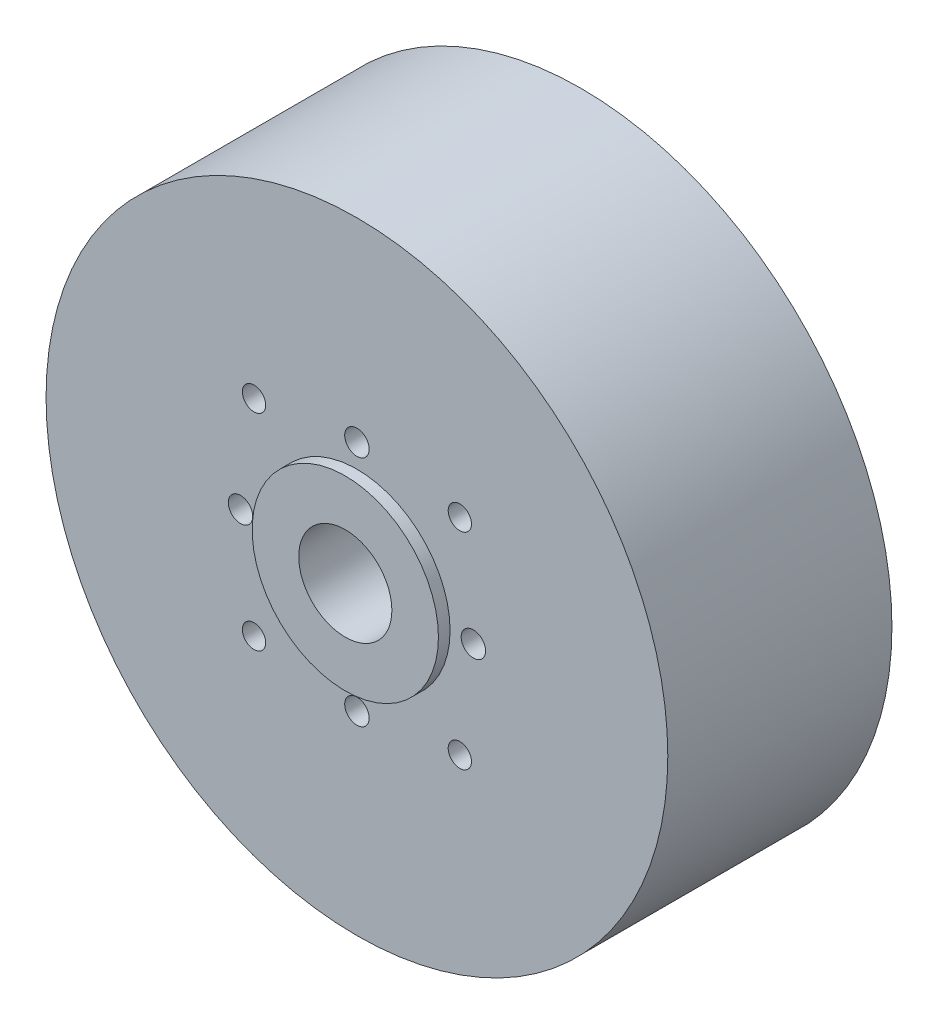
ISO-10303-21;
HEADER;
FILE_DESCRIPTION(('STEP AP214'),'2;1');
FILE_NAME('part.step','',(''),(''),'','','');
FILE_SCHEMA(('AUTOMOTIVE_DESIGN { 1 0 10303 214 1 1 1 1 }'));
ENDSEC;
DATA;
#1=APPLICATION_CONTEXT('core data for automotive mechanical design processes');
#2=APPLICATION_PROTOCOL_DEFINITION('international standard','automotive_design',2000,#1);
#3=PRODUCT_CONTEXT('',#1,'mechanical');
#4=PRODUCT('Part','Part','',(#3));
#5=PRODUCT_RELATED_PRODUCT_CATEGORY('part','',(#4));
#6=PRODUCT_DEFINITION_FORMATION('','',#4);
#7=PRODUCT_DEFINITION_CONTEXT('part definition',#1,'design');
#8=PRODUCT_DEFINITION('design','',#6,#7);
#9=PRODUCT_DEFINITION_SHAPE('','',#8);
#10=(LENGTH_UNIT() NAMED_UNIT(*) SI_UNIT(.MILLI.,.METRE.));
#11=(NAMED_UNIT(*) PLANE_ANGLE_UNIT() SI_UNIT($,.RADIAN.));
#12=(NAMED_UNIT(*) SI_UNIT($,.STERADIAN.) SOLID_ANGLE_UNIT());
#13=UNCERTAINTY_MEASURE_WITH_UNIT(LENGTH_MEASURE(1.E-05),#10,'distance_accuracy_value','');
#14=(GEOMETRIC_REPRESENTATION_CONTEXT(3) GLOBAL_UNCERTAINTY_ASSIGNED_CONTEXT((#13)) GLOBAL_UNIT_ASSIGNED_CONTEXT((#10,
#11,#12)) REPRESENTATION_CONTEXT('',''));
#15=CARTESIAN_POINT('',(0.,0.,0.));
#16=DIRECTION('',(0.,0.,1.));
#17=DIRECTION('',(1.,0.,0.));
#18=AXIS2_PLACEMENT_3D('',#15,#16,#17);
#19=CARTESIAN_POINT('',(0.,0.,0.));
#20=DIRECTION('',(0.,0.,1.));
#21=DIRECTION('',(1.,0.,0.));
#22=AXIS2_PLACEMENT_3D('',#19,#20,#21);
#23=PLANE('',#22);
#24=CARTESIAN_POINT('',(0.,-20.,0.));
#25=DIRECTION('',(0.,0.,1.));
#26=DIRECTION('',(1.,0.,0.));
#27=AXIS2_PLACEMENT_3D('',#24,#25,#26);
#28=CIRCLE('',#27,2.1);
#29=CARTESIAN_POINT('',(2.1,-20.,0.));
#30=VERTEX_POINT('',#29);
#31=EDGE_CURVE('E99',#30,#30,#28,.T.);
#32=ORIENTED_EDGE('',*,*,#31,.F.);
#33=EDGE_LOOP('',(#32));
#34=FACE_BOUND('',#33,.T.);
#35=CARTESIAN_POINT('',(20.,0.,0.));
#36=DIRECTION('',(0.,0.,1.));
#37=DIRECTION('',(1.,0.,0.));
#38=AXIS2_PLACEMENT_3D('',#35,#36,#37);
#39=CIRCLE('',#38,2.1);
#40=CARTESIAN_POINT('',(22.1,0.,0.));
#41=VERTEX_POINT('',#40);
#42=EDGE_CURVE('E96',#41,#41,#39,.T.);
#43=ORIENTED_EDGE('',*,*,#42,.F.);
#44=EDGE_LOOP('',(#43));
#45=FACE_BOUND('',#44,.T.);
#46=CARTESIAN_POINT('',(0.,20.,0.));
#47=DIRECTION('',(0.,0.,1.));
#48=DIRECTION('',(1.,0.,0.));
#49=AXIS2_PLACEMENT_3D('',#46,#47,#48);
#50=CIRCLE('',#49,2.1);
#51=CARTESIAN_POINT('',(2.1,20.,0.));
#52=VERTEX_POINT('',#51);
#53=EDGE_CURVE('E90',#52,#52,#50,.T.);
#54=ORIENTED_EDGE('',*,*,#53,.F.);
#55=EDGE_LOOP('',(#54));
#56=FACE_BOUND('',#55,.T.);
#57=CARTESIAN_POINT('',(-20.,0.,0.));
#58=DIRECTION('',(0.,0.,1.));
#59=DIRECTION('',(1.,0.,0.));
#60=AXIS2_PLACEMENT_3D('',#57,#58,#59);
#61=CIRCLE('',#60,2.1);
#62=CARTESIAN_POINT('',(-17.9,0.,0.));
#63=VERTEX_POINT('',#62);
#64=EDGE_CURVE('E83',#63,#63,#61,.T.);
#65=ORIENTED_EDGE('',*,*,#64,.F.);
#66=EDGE_LOOP('',(#65));
#67=FACE_BOUND('',#66,.T.);
#68=CARTESIAN_POINT('',(0.,0.,0.));
#69=DIRECTION('',(0.,0.,1.));
#70=DIRECTION('',(1.,0.,0.));
#71=AXIS2_PLACEMENT_3D('',#68,#69,#70);
#72=CIRCLE('',#71,53.4);
#73=CARTESIAN_POINT('',(53.4,0.,0.));
#74=VERTEX_POINT('',#73);
#75=EDGE_CURVE('E35',#74,#74,#72,.T.);
#76=ORIENTED_EDGE('',*,*,#75,.T.);
#77=EDGE_LOOP('',(#76));
#78=FACE_BOUND('',#77,.T.);
#79=CARTESIAN_POINT('',(17.6776695296637,-17.6776695296637,0.));
#80=DIRECTION('',(0.,0.,1.));
#81=DIRECTION('',(1.,0.,0.));
#82=AXIS2_PLACEMENT_3D('',#79,#80,#81);
#83=CIRCLE('',#82,2.);
#84=CARTESIAN_POINT('',(19.6776695296637,-17.6776695296637,0.));
#85=VERTEX_POINT('',#84);
#86=EDGE_CURVE('E47',#85,#85,#83,.T.);
#87=ORIENTED_EDGE('',*,*,#86,.F.);
#88=EDGE_LOOP('',(#87));
#89=FACE_BOUND('',#88,.T.);
#90=CARTESIAN_POINT('',(17.6776695296637,17.6776695296637,0.));
#91=DIRECTION('',(0.,0.,1.));
#92=DIRECTION('',(1.,0.,0.));
#93=AXIS2_PLACEMENT_3D('',#90,#91,#92);
#94=CIRCLE('',#93,2.);
#95=CARTESIAN_POINT('',(19.6776695296637,17.6776695296637,0.));
#96=VERTEX_POINT('',#95);
#97=EDGE_CURVE('E50',#96,#96,#94,.T.);
#98=ORIENTED_EDGE('',*,*,#97,.F.);
#99=EDGE_LOOP('',(#98));
#100=FACE_BOUND('',#99,.T.);
#101=CARTESIAN_POINT('',(-17.6776695296638,17.6776695296636,0.));
#102=DIRECTION('',(0.,0.,1.));
#103=DIRECTION('',(1.,0.,0.));
#104=AXIS2_PLACEMENT_3D('',#101,#102,#103);
#105=CIRCLE('',#104,2.00000000000001);
#106=CARTESIAN_POINT('',(-15.6776695296638,17.6776695296636,0.));
#107=VERTEX_POINT('',#106);
#108=EDGE_CURVE('E63',#107,#107,#105,.T.);
#109=ORIENTED_EDGE('',*,*,#108,.F.);
#110=EDGE_LOOP('',(#109));
#111=FACE_BOUND('',#110,.T.);
#112=CARTESIAN_POINT('',(-17.6776695296636,-17.6776695296638,0.));
#113=DIRECTION('',(0.,0.,1.));
#114=DIRECTION('',(1.,0.,0.));
#115=AXIS2_PLACEMENT_3D('',#112,#113,#114);
#116=CIRCLE('',#115,1.99999999999999);
#117=CARTESIAN_POINT('',(-15.6776695296636,-17.6776695296638,0.));
#118=VERTEX_POINT('',#117);
#119=EDGE_CURVE('E56',#118,#118,#116,.T.);
#120=ORIENTED_EDGE('',*,*,#119,.F.);
#121=EDGE_LOOP('',(#120));
#122=FACE_BOUND('',#121,.T.);
#123=CARTESIAN_POINT('',(0.,0.,0.));
#124=DIRECTION('',(0.,0.,1.));
#125=DIRECTION('',(1.,0.,0.));
#126=AXIS2_PLACEMENT_3D('',#123,#124,#125);
#127=CIRCLE('',#126,16.);
#128=CARTESIAN_POINT('',(16.,0.,0.));
#129=VERTEX_POINT('',#128);
#130=EDGE_CURVE('E71',#129,#129,#127,.T.);
#131=ORIENTED_EDGE('',*,*,#130,.F.);
#132=EDGE_LOOP('',(#131));
#133=FACE_BOUND('',#132,.T.);
#134=ADVANCED_FACE('F31',(#34,#45,#56,#67,#78,#89,#100,#111,#122,#133),#23,.T.);
#135=CARTESIAN_POINT('',(0.,0.,-38.5));
#136=DIRECTION('',(0.,0.,1.));
#137=DIRECTION('',(1.,0.,0.));
#138=AXIS2_PLACEMENT_3D('',#135,#136,#137);
#139=CYLINDRICAL_SURFACE('',#138,53.4);
#140=CARTESIAN_POINT('',(0.,0.,-38.5));
#141=DIRECTION('',(0.,0.,1.));
#142=DIRECTION('',(1.,0.,0.));
#143=AXIS2_PLACEMENT_3D('',#140,#141,#142);
#144=CIRCLE('',#143,53.4);
#145=CARTESIAN_POINT('',(53.4,0.,-38.5));
#146=VERTEX_POINT('',#145);
#147=EDGE_CURVE('E10',#146,#146,#144,.T.);
#148=ORIENTED_EDGE('',*,*,#147,.T.);
#149=EDGE_LOOP('',(#148));
#150=FACE_BOUND('',#149,.T.);
#151=ORIENTED_EDGE('',*,*,#75,.F.);
#152=EDGE_LOOP('',(#151));
#153=FACE_BOUND('',#152,.T.);
#154=ADVANCED_FACE('F33',(#150,#153),#139,.T.);
#155=CARTESIAN_POINT('',(0.,0.,-38.5));
#156=DIRECTION('',(0.,0.,1.));
#157=DIRECTION('',(1.,0.,0.));
#158=AXIS2_PLACEMENT_3D('',#155,#156,#157);
#159=PLANE('',#158);
#160=CARTESIAN_POINT('',(30.,0.,-38.5));
#161=DIRECTION('',(0.,0.,-1.));
#162=DIRECTION('',(-1.,0.,0.));
#163=AXIS2_PLACEMENT_3D('',#160,#161,#162);
#164=CIRCLE('',#163,2.5);
#165=CARTESIAN_POINT('',(27.5,0.,-38.5));
#166=VERTEX_POINT('',#165);
#167=EDGE_CURVE('E122',#166,#166,#164,.T.);
#168=ORIENTED_EDGE('',*,*,#167,.F.);
#169=EDGE_LOOP('',(#168));
#170=FACE_BOUND('',#169,.T.);
#171=CARTESIAN_POINT('',(0.,30.,-38.5));
#172=DIRECTION('',(0.,0.,-1.));
#173=DIRECTION('',(-1.,0.,0.));
#174=AXIS2_PLACEMENT_3D('',#171,#172,#173);
#175=CIRCLE('',#174,2.5);
#176=CARTESIAN_POINT('',(-2.5,30.,-38.5));
#177=VERTEX_POINT('',#176);
#178=EDGE_CURVE('E119',#177,#177,#175,.T.);
#179=ORIENTED_EDGE('',*,*,#178,.F.);
#180=EDGE_LOOP('',(#179));
#181=FACE_BOUND('',#180,.T.);
#182=CARTESIAN_POINT('',(-30.,0.,-38.5));
#183=DIRECTION('',(0.,0.,-1.));
#184=DIRECTION('',(-1.,0.,0.));
#185=AXIS2_PLACEMENT_3D('',#182,#183,#184);
#186=CIRCLE('',#185,2.5);
#187=CARTESIAN_POINT('',(-32.5,0.,-38.5));
#188=VERTEX_POINT('',#187);
#189=EDGE_CURVE('E113',#188,#188,#186,.T.);
#190=ORIENTED_EDGE('',*,*,#189,.F.);
#191=EDGE_LOOP('',(#190));
#192=FACE_BOUND('',#191,.T.);
#193=CARTESIAN_POINT('',(0.,-30.,-38.5));
#194=DIRECTION('',(0.,0.,-1.));
#195=DIRECTION('',(-1.,0.,0.));
#196=AXIS2_PLACEMENT_3D('',#193,#194,#195);
#197=CIRCLE('',#196,2.5);
#198=CARTESIAN_POINT('',(-2.5,-30.,-38.5));
#199=VERTEX_POINT('',#198);
#200=EDGE_CURVE('E107',#199,#199,#197,.T.);
#201=ORIENTED_EDGE('',*,*,#200,.F.);
#202=EDGE_LOOP('',(#201));
#203=FACE_BOUND('',#202,.T.);
#204=CARTESIAN_POINT('',(0.,0.,-38.5));
#205=DIRECTION('',(0.,0.,1.));
#206=DIRECTION('',(1.,0.,0.));
#207=AXIS2_PLACEMENT_3D('',#204,#205,#206);
#208=CIRCLE('',#207,8.);
#209=CARTESIAN_POINT('',(8.,0.,-38.5));
#210=VERTEX_POINT('',#209);
#211=EDGE_CURVE('E42',#210,#210,#208,.T.);
#212=ORIENTED_EDGE('',*,*,#211,.T.);
#213=EDGE_LOOP('',(#212));
#214=FACE_BOUND('',#213,.T.);
#215=ORIENTED_EDGE('',*,*,#147,.F.);
#216=EDGE_LOOP('',(#215));
#217=FACE_BOUND('',#216,.T.);
#218=ADVANCED_FACE('F137',(#170,#181,#192,#203,#214,#217),#159,.F.);
#219=CARTESIAN_POINT('',(0.,0.,-38.5));
#220=DIRECTION('',(0.,0.,1.));
#221=DIRECTION('',(1.,0.,0.));
#222=AXIS2_PLACEMENT_3D('',#219,#220,#221);
#223=CYLINDRICAL_SURFACE('',#222,8.);
#224=ORIENTED_EDGE('',*,*,#211,.F.);
#225=EDGE_LOOP('',(#224));
#226=FACE_BOUND('',#225,.T.);
#227=CARTESIAN_POINT('',(0.,0.,2.));
#228=DIRECTION('',(0.,0.,1.));
#229=DIRECTION('',(1.,0.,0.));
#230=AXIS2_PLACEMENT_3D('',#227,#228,#229);
#231=CIRCLE('',#230,8.);
#232=CARTESIAN_POINT('',(8.,0.,2.));
#233=VERTEX_POINT('',#232);
#234=EDGE_CURVE('E74',#233,#233,#231,.T.);
#235=ORIENTED_EDGE('',*,*,#234,.T.);
#236=EDGE_LOOP('',(#235));
#237=FACE_BOUND('',#236,.T.);
#238=ADVANCED_FACE('F140',(#226,#237),#223,.F.);
#239=CARTESIAN_POINT('',(17.6776695296637,-17.6776695296637,-20.));
#240=DIRECTION('',(0.,0.,1.));
#241=DIRECTION('',(1.,0.,0.));
#242=AXIS2_PLACEMENT_3D('',#239,#240,#241);
#243=CYLINDRICAL_SURFACE('',#242,2.);
#244=CARTESIAN_POINT('',(17.6776695296637,-17.6776695296637,-20.));
#245=DIRECTION('',(0.,0.,1.));
#246=DIRECTION('',(1.,0.,0.));
#247=AXIS2_PLACEMENT_3D('',#244,#245,#246);
#248=CIRCLE('',#247,2.);
#249=CARTESIAN_POINT('',(19.6776695296637,-17.6776695296637,-20.));
#250=VERTEX_POINT('',#249);
#251=EDGE_CURVE('E46',#250,#250,#248,.T.);
#252=ORIENTED_EDGE('',*,*,#251,.F.);
#253=EDGE_LOOP('',(#252));
#254=FACE_BOUND('',#253,.T.);
#255=ORIENTED_EDGE('',*,*,#86,.T.);
#256=EDGE_LOOP('',(#255));
#257=FACE_BOUND('',#256,.T.);
#258=ADVANCED_FACE('F153',(#254,#257),#243,.F.);
#259=CARTESIAN_POINT('',(17.6776695296637,-17.6776695296637,-20.));
#260=DIRECTION('',(0.,0.,1.));
#261=DIRECTION('',(1.,0.,0.));
#262=AXIS2_PLACEMENT_3D('',#259,#260,#261);
#263=PLANE('',#262);
#264=ORIENTED_EDGE('',*,*,#251,.T.);
#265=EDGE_LOOP('',(#264));
#266=FACE_BOUND('',#265,.T.);
#267=ADVANCED_FACE('F186',(#266),#263,.T.);
#268=CARTESIAN_POINT('',(17.6776695296637,17.6776695296637,-20.));
#269=DIRECTION('',(0.,0.,1.));
#270=DIRECTION('',(1.,0.,0.));
#271=AXIS2_PLACEMENT_3D('',#268,#269,#270);
#272=CYLINDRICAL_SURFACE('',#271,2.);
#273=CARTESIAN_POINT('',(17.6776695296637,17.6776695296637,-20.));
#274=DIRECTION('',(0.,0.,1.));
#275=DIRECTION('',(1.,0.,0.));
#276=AXIS2_PLACEMENT_3D('',#273,#274,#275);
#277=CIRCLE('',#276,2.);
#278=CARTESIAN_POINT('',(19.6776695296637,17.6776695296637,-20.));
#279=VERTEX_POINT('',#278);
#280=EDGE_CURVE('E66',#279,#279,#277,.T.);
#281=ORIENTED_EDGE('',*,*,#280,.F.);
#282=EDGE_LOOP('',(#281));
#283=FACE_BOUND('',#282,.T.);
#284=ORIENTED_EDGE('',*,*,#97,.T.);
#285=EDGE_LOOP('',(#284));
#286=FACE_BOUND('',#285,.T.);
#287=ADVANCED_FACE('F189',(#283,#286),#272,.F.);
#288=CARTESIAN_POINT('',(17.6776695296637,17.6776695296637,-20.));
#289=DIRECTION('',(0.,0.,1.));
#290=DIRECTION('',(1.,0.,0.));
#291=AXIS2_PLACEMENT_3D('',#288,#289,#290);
#292=PLANE('',#291);
#293=ORIENTED_EDGE('',*,*,#280,.T.);
#294=EDGE_LOOP('',(#293));
#295=FACE_BOUND('',#294,.T.);
#296=ADVANCED_FACE('F202',(#295),#292,.T.);
#297=CARTESIAN_POINT('',(-17.6776695296638,17.6776695296636,-20.));
#298=DIRECTION('',(0.,0.,1.));
#299=DIRECTION('',(1.,0.,0.));
#300=AXIS2_PLACEMENT_3D('',#297,#298,#299);
#301=CYLINDRICAL_SURFACE('',#300,2.00000000000001);
#302=CARTESIAN_POINT('',(-17.6776695296638,17.6776695296636,-20.));
#303=DIRECTION('',(0.,0.,1.));
#304=DIRECTION('',(1.,0.,0.));
#305=AXIS2_PLACEMENT_3D('',#302,#303,#304);
#306=CIRCLE('',#305,2.00000000000001);
#307=CARTESIAN_POINT('',(-15.6776695296638,17.6776695296636,-20.));
#308=VERTEX_POINT('',#307);
#309=EDGE_CURVE('E60',#308,#308,#306,.T.);
#310=ORIENTED_EDGE('',*,*,#309,.F.);
#311=EDGE_LOOP('',(#310));
#312=FACE_BOUND('',#311,.T.);
#313=ORIENTED_EDGE('',*,*,#108,.T.);
#314=EDGE_LOOP('',(#313));
#315=FACE_BOUND('',#314,.T.);
#316=ADVANCED_FACE('F198',(#312,#315),#301,.F.);
#317=CARTESIAN_POINT('',(-17.6776695296638,17.6776695296636,-20.));
#318=DIRECTION('',(0.,0.,1.));
#319=DIRECTION('',(1.,0.,0.));
#320=AXIS2_PLACEMENT_3D('',#317,#318,#319);
#321=PLANE('',#320);
#322=ORIENTED_EDGE('',*,*,#309,.T.);
#323=EDGE_LOOP('',(#322));
#324=FACE_BOUND('',#323,.T.);
#325=ADVANCED_FACE('F194',(#324),#321,.T.);
#326=CARTESIAN_POINT('',(-17.6776695296636,-17.6776695296638,-20.));
#327=DIRECTION('',(0.,0.,1.));
#328=DIRECTION('',(1.,0.,0.));
#329=AXIS2_PLACEMENT_3D('',#326,#327,#328);
#330=CYLINDRICAL_SURFACE('',#329,1.99999999999999);
#331=CARTESIAN_POINT('',(-17.6776695296636,-17.6776695296638,-20.));
#332=DIRECTION('',(0.,0.,1.));
#333=DIRECTION('',(1.,0.,0.));
#334=AXIS2_PLACEMENT_3D('',#331,#332,#333);
#335=CIRCLE('',#334,1.99999999999999);
#336=CARTESIAN_POINT('',(-15.6776695296636,-17.6776695296638,-20.));
#337=VERTEX_POINT('',#336);
#338=EDGE_CURVE('E53',#337,#337,#335,.T.);
#339=ORIENTED_EDGE('',*,*,#338,.F.);
#340=EDGE_LOOP('',(#339));
#341=FACE_BOUND('',#340,.T.);
#342=ORIENTED_EDGE('',*,*,#119,.T.);
#343=EDGE_LOOP('',(#342));
#344=FACE_BOUND('',#343,.T.);
#345=ADVANCED_FACE('F170',(#341,#344),#330,.F.);
#346=CARTESIAN_POINT('',(-17.6776695296636,-17.6776695296638,-20.));
#347=DIRECTION('',(0.,0.,1.));
#348=DIRECTION('',(1.,0.,0.));
#349=AXIS2_PLACEMENT_3D('',#346,#347,#348);
#350=PLANE('',#349);
#351=ORIENTED_EDGE('',*,*,#338,.T.);
#352=EDGE_LOOP('',(#351));
#353=FACE_BOUND('',#352,.T.);
#354=ADVANCED_FACE('F160',(#353),#350,.T.);
#355=CARTESIAN_POINT('',(0.,0.,2.));
#356=DIRECTION('',(0.,0.,1.));
#357=DIRECTION('',(1.,0.,0.));
#358=AXIS2_PLACEMENT_3D('',#355,#356,#357);
#359=PLANE('',#358);
#360=CARTESIAN_POINT('',(0.,0.,2.));
#361=DIRECTION('',(0.,0.,1.));
#362=DIRECTION('',(1.,0.,0.));
#363=AXIS2_PLACEMENT_3D('',#360,#361,#362);
#364=CIRCLE('',#363,16.);
#365=CARTESIAN_POINT('',(16.,0.,2.));
#366=VERTEX_POINT('',#365);
#367=EDGE_CURVE('E57',#366,#366,#364,.T.);
#368=ORIENTED_EDGE('',*,*,#367,.T.);
#369=EDGE_LOOP('',(#368));
#370=FACE_BOUND('',#369,.T.);
#371=ORIENTED_EDGE('',*,*,#234,.F.);
#372=EDGE_LOOP('',(#371));
#373=FACE_BOUND('',#372,.T.);
#374=ADVANCED_FACE('F157',(#370,#373),#359,.T.);
#375=CARTESIAN_POINT('',(0.,0.,2.));
#376=DIRECTION('',(0.,0.,-1.));
#377=DIRECTION('',(-1.,0.,0.));
#378=AXIS2_PLACEMENT_3D('',#375,#376,#377);
#379=CYLINDRICAL_SURFACE('',#378,16.);
#380=ORIENTED_EDGE('',*,*,#367,.F.);
#381=EDGE_LOOP('',(#380));
#382=FACE_BOUND('',#381,.T.);
#383=ORIENTED_EDGE('',*,*,#130,.T.);
#384=EDGE_LOOP('',(#383));
#385=FACE_BOUND('',#384,.T.);
#386=ADVANCED_FACE('F159',(#382,#385),#379,.T.);
#387=CARTESIAN_POINT('',(-20.,0.,-20.));
#388=DIRECTION('',(0.,0.,1.));
#389=DIRECTION('',(1.,0.,0.));
#390=AXIS2_PLACEMENT_3D('',#387,#388,#389);
#391=CYLINDRICAL_SURFACE('',#390,2.1);
#392=CARTESIAN_POINT('',(-20.,0.,-20.));
#393=DIRECTION('',(0.,0.,1.));
#394=DIRECTION('',(1.,0.,0.));
#395=AXIS2_PLACEMENT_3D('',#392,#393,#394);
#396=CIRCLE('',#395,2.1);
#397=CARTESIAN_POINT('',(-17.9,0.,-20.));
#398=VERTEX_POINT('',#397);
#399=EDGE_CURVE('E80',#398,#398,#396,.T.);
#400=ORIENTED_EDGE('',*,*,#399,.F.);
#401=EDGE_LOOP('',(#400));
#402=FACE_BOUND('',#401,.T.);
#403=ORIENTED_EDGE('',*,*,#64,.T.);
#404=EDGE_LOOP('',(#403));
#405=FACE_BOUND('',#404,.T.);
#406=ADVANCED_FACE('F167',(#402,#405),#391,.F.);
#407=CARTESIAN_POINT('',(-20.,0.,-20.));
#408=DIRECTION('',(0.,0.,1.));
#409=DIRECTION('',(1.,0.,0.));
#410=AXIS2_PLACEMENT_3D('',#407,#408,#409);
#411=PLANE('',#410);
#412=ORIENTED_EDGE('',*,*,#399,.T.);
#413=EDGE_LOOP('',(#412));
#414=FACE_BOUND('',#413,.T.);
#415=ADVANCED_FACE('F272',(#414),#411,.T.);
#416=CARTESIAN_POINT('',(0.,20.,-20.));
#417=DIRECTION('',(0.,0.,1.));
#418=DIRECTION('',(1.,0.,0.));
#419=AXIS2_PLACEMENT_3D('',#416,#417,#418);
#420=CYLINDRICAL_SURFACE('',#419,2.1);
#421=CARTESIAN_POINT('',(0.,20.,-20.));
#422=DIRECTION('',(0.,0.,1.));
#423=DIRECTION('',(1.,0.,0.));
#424=AXIS2_PLACEMENT_3D('',#421,#422,#423);
#425=CIRCLE('',#424,2.1);
#426=CARTESIAN_POINT('',(2.1,20.,-20.));
#427=VERTEX_POINT('',#426);
#428=EDGE_CURVE('E87',#427,#427,#425,.T.);
#429=ORIENTED_EDGE('',*,*,#428,.F.);
#430=EDGE_LOOP('',(#429));
#431=FACE_BOUND('',#430,.T.);
#432=ORIENTED_EDGE('',*,*,#53,.T.);
#433=EDGE_LOOP('',(#432));
#434=FACE_BOUND('',#433,.T.);
#435=ADVANCED_FACE('F279',(#431,#434),#420,.F.);
#436=CARTESIAN_POINT('',(0.,20.,-20.));
#437=DIRECTION('',(0.,0.,1.));
#438=DIRECTION('',(1.,0.,0.));
#439=AXIS2_PLACEMENT_3D('',#436,#437,#438);
#440=PLANE('',#439);
#441=ORIENTED_EDGE('',*,*,#428,.T.);
#442=EDGE_LOOP('',(#441));
#443=FACE_BOUND('',#442,.T.);
#444=ADVANCED_FACE('F286',(#443),#440,.T.);
#445=CARTESIAN_POINT('',(20.,0.,-20.));
#446=DIRECTION('',(0.,0.,1.));
#447=DIRECTION('',(1.,0.,0.));
#448=AXIS2_PLACEMENT_3D('',#445,#446,#447);
#449=CYLINDRICAL_SURFACE('',#448,2.1);
#450=CARTESIAN_POINT('',(20.,0.,-20.));
#451=DIRECTION('',(0.,0.,1.));
#452=DIRECTION('',(1.,0.,0.));
#453=AXIS2_PLACEMENT_3D('',#450,#451,#452);
#454=CIRCLE('',#453,2.1);
#455=CARTESIAN_POINT('',(22.1,0.,-20.));
#456=VERTEX_POINT('',#455);
#457=EDGE_CURVE('E93',#456,#456,#454,.T.);
#458=ORIENTED_EDGE('',*,*,#457,.F.);
#459=EDGE_LOOP('',(#458));
#460=FACE_BOUND('',#459,.T.);
#461=ORIENTED_EDGE('',*,*,#42,.T.);
#462=EDGE_LOOP('',(#461));
#463=FACE_BOUND('',#462,.T.);
#464=ADVANCED_FACE('F294',(#460,#463),#449,.F.);
#465=CARTESIAN_POINT('',(20.,0.,-20.));
#466=DIRECTION('',(0.,0.,1.));
#467=DIRECTION('',(1.,0.,0.));
#468=AXIS2_PLACEMENT_3D('',#465,#466,#467);
#469=PLANE('',#468);
#470=ORIENTED_EDGE('',*,*,#457,.T.);
#471=EDGE_LOOP('',(#470));
#472=FACE_BOUND('',#471,.T.);
#473=ADVANCED_FACE('F302',(#472),#469,.T.);
#474=CARTESIAN_POINT('',(0.,-20.,-20.));
#475=DIRECTION('',(0.,0.,1.));
#476=DIRECTION('',(1.,0.,0.));
#477=AXIS2_PLACEMENT_3D('',#474,#475,#476);
#478=CYLINDRICAL_SURFACE('',#477,2.1);
#479=CARTESIAN_POINT('',(0.,-20.,-20.));
#480=DIRECTION('',(0.,0.,1.));
#481=DIRECTION('',(1.,0.,0.));
#482=AXIS2_PLACEMENT_3D('',#479,#480,#481);
#483=CIRCLE('',#482,2.1);
#484=CARTESIAN_POINT('',(2.1,-20.,-20.));
#485=VERTEX_POINT('',#484);
#486=EDGE_CURVE('E79',#485,#485,#483,.T.);
#487=ORIENTED_EDGE('',*,*,#486,.F.);
#488=EDGE_LOOP('',(#487));
#489=FACE_BOUND('',#488,.T.);
#490=ORIENTED_EDGE('',*,*,#31,.T.);
#491=EDGE_LOOP('',(#490));
#492=FACE_BOUND('',#491,.T.);
#493=ADVANCED_FACE('F310',(#489,#492),#478,.F.);
#494=CARTESIAN_POINT('',(0.,-20.,-20.));
#495=DIRECTION('',(0.,0.,1.));
#496=DIRECTION('',(1.,0.,0.));
#497=AXIS2_PLACEMENT_3D('',#494,#495,#496);
#498=PLANE('',#497);
#499=ORIENTED_EDGE('',*,*,#486,.T.);
#500=EDGE_LOOP('',(#499));
#501=FACE_BOUND('',#500,.T.);
#502=ADVANCED_FACE('F318',(#501),#498,.T.);
#503=CARTESIAN_POINT('',(0.,-30.,-18.5));
#504=DIRECTION('',(0.,0.,-1.));
#505=DIRECTION('',(-1.,0.,0.));
#506=AXIS2_PLACEMENT_3D('',#503,#504,#505);
#507=CYLINDRICAL_SURFACE('',#506,2.5);
#508=CARTESIAN_POINT('',(0.,-30.,-18.5));
#509=DIRECTION('',(0.,0.,-1.));
#510=DIRECTION('',(-1.,0.,0.));
#511=AXIS2_PLACEMENT_3D('',#508,#509,#510);
#512=CIRCLE('',#511,2.5);
#513=CARTESIAN_POINT('',(-2.5,-30.,-18.5));
#514=VERTEX_POINT('',#513);
#515=EDGE_CURVE('E104',#514,#514,#512,.T.);
#516=ORIENTED_EDGE('',*,*,#515,.F.);
#517=EDGE_LOOP('',(#516));
#518=FACE_BOUND('',#517,.T.);
#519=ORIENTED_EDGE('',*,*,#200,.T.);
#520=EDGE_LOOP('',(#519));
#521=FACE_BOUND('',#520,.T.);
#522=ADVANCED_FACE('F326',(#518,#521),#507,.F.);
#523=CARTESIAN_POINT('',(0.,-30.,-18.5));
#524=DIRECTION('',(0.,0.,-1.));
#525=DIRECTION('',(-1.,0.,0.));
#526=AXIS2_PLACEMENT_3D('',#523,#524,#525);
#527=PLANE('',#526);
#528=ORIENTED_EDGE('',*,*,#515,.T.);
#529=EDGE_LOOP('',(#528));
#530=FACE_BOUND('',#529,.T.);
#531=ADVANCED_FACE('F334',(#530),#527,.T.);
#532=CARTESIAN_POINT('',(-30.,0.,-18.5));
#533=DIRECTION('',(0.,0.,-1.));
#534=DIRECTION('',(-1.,0.,0.));
#535=AXIS2_PLACEMENT_3D('',#532,#533,#534);
#536=CYLINDRICAL_SURFACE('',#535,2.5);
#537=CARTESIAN_POINT('',(-30.,0.,-18.5));
#538=DIRECTION('',(0.,0.,-1.));
#539=DIRECTION('',(-1.,0.,0.));
#540=AXIS2_PLACEMENT_3D('',#537,#538,#539);
#541=CIRCLE('',#540,2.5);
#542=CARTESIAN_POINT('',(-32.5,0.,-18.5));
#543=VERTEX_POINT('',#542);
#544=EDGE_CURVE('E110',#543,#543,#541,.T.);
#545=ORIENTED_EDGE('',*,*,#544,.F.);
#546=EDGE_LOOP('',(#545));
#547=FACE_BOUND('',#546,.T.);
#548=ORIENTED_EDGE('',*,*,#189,.T.);
#549=EDGE_LOOP('',(#548));
#550=FACE_BOUND('',#549,.T.);
#551=ADVANCED_FACE('F342',(#547,#550),#536,.F.);
#552=CARTESIAN_POINT('',(-30.,0.,-18.5));
#553=DIRECTION('',(0.,0.,-1.));
#554=DIRECTION('',(-1.,0.,0.));
#555=AXIS2_PLACEMENT_3D('',#552,#553,#554);
#556=PLANE('',#555);
#557=ORIENTED_EDGE('',*,*,#544,.T.);
#558=EDGE_LOOP('',(#557));
#559=FACE_BOUND('',#558,.T.);
#560=ADVANCED_FACE('F350',(#559),#556,.T.);
#561=CARTESIAN_POINT('',(0.,30.,-18.5));
#562=DIRECTION('',(0.,0.,-1.));
#563=DIRECTION('',(-1.,0.,0.));
#564=AXIS2_PLACEMENT_3D('',#561,#562,#563);
#565=CYLINDRICAL_SURFACE('',#564,2.5);
#566=CARTESIAN_POINT('',(0.,30.,-18.5));
#567=DIRECTION('',(0.,0.,-1.));
#568=DIRECTION('',(-1.,0.,0.));
#569=AXIS2_PLACEMENT_3D('',#566,#567,#568);
#570=CIRCLE('',#569,2.5);
#571=CARTESIAN_POINT('',(-2.5,30.,-18.5));
#572=VERTEX_POINT('',#571);
#573=EDGE_CURVE('E116',#572,#572,#570,.T.);
#574=ORIENTED_EDGE('',*,*,#573,.F.);
#575=EDGE_LOOP('',(#574));
#576=FACE_BOUND('',#575,.T.);
#577=ORIENTED_EDGE('',*,*,#178,.T.);
#578=EDGE_LOOP('',(#577));
#579=FACE_BOUND('',#578,.T.);
#580=ADVANCED_FACE('F358',(#576,#579),#565,.F.);
#581=CARTESIAN_POINT('',(0.,30.,-18.5));
#582=DIRECTION('',(0.,0.,-1.));
#583=DIRECTION('',(-1.,0.,0.));
#584=AXIS2_PLACEMENT_3D('',#581,#582,#583);
#585=PLANE('',#584);
#586=ORIENTED_EDGE('',*,*,#573,.T.);
#587=EDGE_LOOP('',(#586));
#588=FACE_BOUND('',#587,.T.);
#589=ADVANCED_FACE('F133',(#588),#585,.T.);
#590=CARTESIAN_POINT('',(30.,0.,-18.5));
#591=DIRECTION('',(0.,0.,-1.));
#592=DIRECTION('',(-1.,0.,0.));
#593=AXIS2_PLACEMENT_3D('',#590,#591,#592);
#594=CYLINDRICAL_SURFACE('',#593,2.5);
#595=CARTESIAN_POINT('',(30.,0.,-18.5));
#596=DIRECTION('',(0.,0.,-1.));
#597=DIRECTION('',(-1.,0.,0.));
#598=AXIS2_PLACEMENT_3D('',#595,#596,#597);
#599=CIRCLE('',#598,2.5);
#600=CARTESIAN_POINT('',(27.5,0.,-18.5));
#601=VERTEX_POINT('',#600);
#602=EDGE_CURVE('E84',#601,#601,#599,.T.);
#603=ORIENTED_EDGE('',*,*,#602,.F.);
#604=EDGE_LOOP('',(#603));
#605=FACE_BOUND('',#604,.T.);
#606=ORIENTED_EDGE('',*,*,#167,.T.);
#607=EDGE_LOOP('',(#606));
#608=FACE_BOUND('',#607,.T.);
#609=ADVANCED_FACE('F130',(#605,#608),#594,.F.);
#610=CARTESIAN_POINT('',(30.,0.,-18.5));
#611=DIRECTION('',(0.,0.,-1.));
#612=DIRECTION('',(-1.,0.,0.));
#613=AXIS2_PLACEMENT_3D('',#610,#611,#612);
#614=PLANE('',#613);
#615=ORIENTED_EDGE('',*,*,#602,.T.);
#616=EDGE_LOOP('',(#615));
#617=FACE_BOUND('',#616,.T.);
#618=ADVANCED_FACE('F128',(#617),#614,.T.);
#619=CLOSED_SHELL('',(#134,#154,#218,#238,#258,#267,#287,#296,#316,#325,#345,#354,#374,#386,
#406,#415,#435,#444,#464,#473,#493,#502,#522,#531,#551,#560,#580,#589,#609,#618));
#620=MANIFOLD_SOLID_BREP('B2',#619);
#621=ADVANCED_BREP_SHAPE_REPRESENTATION('',(#18,#620),#14);
#622=SHAPE_DEFINITION_REPRESENTATION(#9,#621);
ENDSEC;
END-ISO-10303-21;
